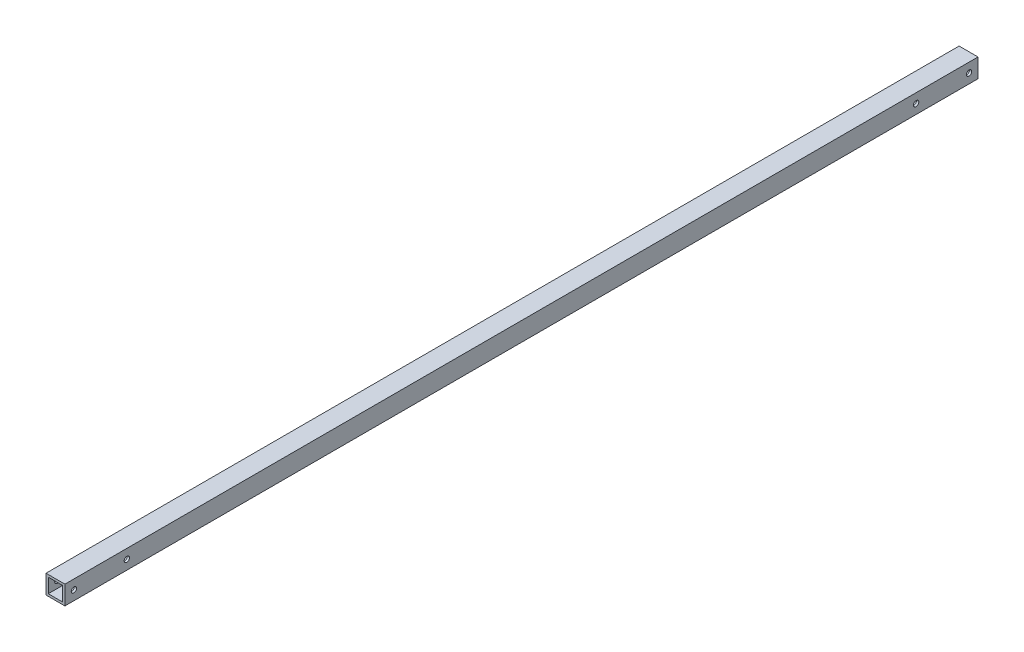
ISO-10303-21;
HEADER;
FILE_DESCRIPTION(('STEP AP214'),'2;1');
FILE_NAME('part.step','',(''),(''),'','','');
FILE_SCHEMA(('AUTOMOTIVE_DESIGN { 1 0 10303 214 1 1 1 1 }'));
ENDSEC;
DATA;
#1=APPLICATION_CONTEXT('core data for automotive mechanical design processes');
#2=APPLICATION_PROTOCOL_DEFINITION('international standard','automotive_design',2000,#1);
#3=PRODUCT_CONTEXT('',#1,'mechanical');
#4=PRODUCT('Part','Part','',(#3));
#5=PRODUCT_RELATED_PRODUCT_CATEGORY('part','',(#4));
#6=PRODUCT_DEFINITION_FORMATION('','',#4);
#7=PRODUCT_DEFINITION_CONTEXT('part definition',#1,'design');
#8=PRODUCT_DEFINITION('design','',#6,#7);
#9=PRODUCT_DEFINITION_SHAPE('','',#8);
#10=(LENGTH_UNIT() NAMED_UNIT(*) SI_UNIT(.MILLI.,.METRE.));
#11=(NAMED_UNIT(*) PLANE_ANGLE_UNIT() SI_UNIT($,.RADIAN.));
#12=(NAMED_UNIT(*) SI_UNIT($,.STERADIAN.) SOLID_ANGLE_UNIT());
#13=UNCERTAINTY_MEASURE_WITH_UNIT(LENGTH_MEASURE(1.E-05),#10,'distance_accuracy_value','');
#14=(GEOMETRIC_REPRESENTATION_CONTEXT(3) GLOBAL_UNCERTAINTY_ASSIGNED_CONTEXT((#13)) GLOBAL_UNIT_ASSIGNED_CONTEXT((#10,
#11,#12)) REPRESENTATION_CONTEXT('',''));
#15=CARTESIAN_POINT('',(0.,0.,0.));
#16=DIRECTION('',(0.,0.,1.));
#17=DIRECTION('',(1.,0.,0.));
#18=AXIS2_PLACEMENT_3D('',#15,#16,#17);
#19=CARTESIAN_POINT('',(0.,-25.,1207.3));
#20=DIRECTION('',(0.,0.,1.));
#21=DIRECTION('',(1.,0.,0.));
#22=AXIS2_PLACEMENT_3D('',#19,#20,#21);
#23=PLANE('',#22);
#24=DIRECTION('',(0.,-1.,0.));
#25=VECTOR('',#24,1.);
#26=CARTESIAN_POINT('',(0.,0.,1207.3));
#27=LINE('',#26,#25);
#28=CARTESIAN_POINT('',(0.,0.,1207.3));
#29=VERTEX_POINT('',#28);
#30=CARTESIAN_POINT('',(0.,-25.,1207.3));
#31=VERTEX_POINT('',#30);
#32=EDGE_CURVE('E140',#29,#31,#27,.T.);
#33=ORIENTED_EDGE('',*,*,#32,.T.);
#34=DIRECTION('',(1.,0.,0.));
#35=VECTOR('',#34,1.);
#36=CARTESIAN_POINT('',(0.,-25.,1207.3));
#37=LINE('',#36,#35);
#38=CARTESIAN_POINT('',(25.,-25.,1207.3));
#39=VERTEX_POINT('',#38);
#40=EDGE_CURVE('E143',#31,#39,#37,.T.);
#41=ORIENTED_EDGE('',*,*,#40,.T.);
#42=DIRECTION('',(0.,1.,0.));
#43=VECTOR('',#42,1.);
#44=CARTESIAN_POINT('',(25.,0.,1207.3));
#45=LINE('',#44,#43);
#46=CARTESIAN_POINT('',(25.,0.,1207.3));
#47=VERTEX_POINT('',#46);
#48=EDGE_CURVE('E146',#39,#47,#45,.T.);
#49=ORIENTED_EDGE('',*,*,#48,.T.);
#50=DIRECTION('',(-1.,0.,0.));
#51=VECTOR('',#50,1.);
#52=CARTESIAN_POINT('',(0.,0.,1207.3));
#53=LINE('',#52,#51);
#54=EDGE_CURVE('E148',#47,#29,#53,.T.);
#55=ORIENTED_EDGE('',*,*,#54,.T.);
#56=EDGE_LOOP('',(#33,#41,#49,#55));
#57=FACE_BOUND('',#56,.T.);
#58=DIRECTION('',(1.,0.,0.));
#59=VECTOR('',#58,1.);
#60=CARTESIAN_POINT('',(3.,-22.,1207.3));
#61=LINE('',#60,#59);
#62=CARTESIAN_POINT('',(3.,-22.,1207.3));
#63=VERTEX_POINT('',#62);
#64=CARTESIAN_POINT('',(22.,-22.,1207.3));
#65=VERTEX_POINT('',#64);
#66=EDGE_CURVE('E110',#63,#65,#61,.T.);
#67=ORIENTED_EDGE('',*,*,#66,.F.);
#68=DIRECTION('',(0.,-1.,0.));
#69=VECTOR('',#68,1.);
#70=CARTESIAN_POINT('',(3.,-3.,1207.3));
#71=LINE('',#70,#69);
#72=CARTESIAN_POINT('',(3.,-3.,1207.3));
#73=VERTEX_POINT('',#72);
#74=EDGE_CURVE('E102',#73,#63,#71,.T.);
#75=ORIENTED_EDGE('',*,*,#74,.F.);
#76=DIRECTION('',(-1.,0.,0.));
#77=VECTOR('',#76,1.);
#78=CARTESIAN_POINT('',(3.,-3.,1207.3));
#79=LINE('',#78,#77);
#80=CARTESIAN_POINT('',(22.,-3.,1207.3));
#81=VERTEX_POINT('',#80);
#82=EDGE_CURVE('E124',#81,#73,#79,.T.);
#83=ORIENTED_EDGE('',*,*,#82,.F.);
#84=DIRECTION('',(0.,1.,0.));
#85=VECTOR('',#84,1.);
#86=CARTESIAN_POINT('',(22.,-3.,1207.3));
#87=LINE('',#86,#85);
#88=EDGE_CURVE('E122',#65,#81,#87,.T.);
#89=ORIENTED_EDGE('',*,*,#88,.F.);
#90=EDGE_LOOP('',(#67,#75,#83,#89));
#91=FACE_BOUND('',#90,.T.);
#92=ADVANCED_FACE('F35',(#57,#91),#23,.T.);
#93=CARTESIAN_POINT('',(0.,-25.,0.));
#94=DIRECTION('',(0.,0.,1.));
#95=DIRECTION('',(1.,0.,0.));
#96=AXIS2_PLACEMENT_3D('',#93,#94,#95);
#97=PLANE('',#96);
#98=DIRECTION('',(0.,-1.,0.));
#99=VECTOR('',#98,1.);
#100=CARTESIAN_POINT('',(0.,0.,0.));
#101=LINE('',#100,#99);
#102=CARTESIAN_POINT('',(0.,0.,0.));
#103=VERTEX_POINT('',#102);
#104=CARTESIAN_POINT('',(0.,-25.,0.));
#105=VERTEX_POINT('',#104);
#106=EDGE_CURVE('E118',#103,#105,#101,.T.);
#107=ORIENTED_EDGE('',*,*,#106,.F.);
#108=DIRECTION('',(-1.,0.,0.));
#109=VECTOR('',#108,1.);
#110=CARTESIAN_POINT('',(0.,0.,0.));
#111=LINE('',#110,#109);
#112=CARTESIAN_POINT('',(25.,0.,0.));
#113=VERTEX_POINT('',#112);
#114=EDGE_CURVE('E144',#113,#103,#111,.T.);
#115=ORIENTED_EDGE('',*,*,#114,.F.);
#116=DIRECTION('',(0.,1.,0.));
#117=VECTOR('',#116,1.);
#118=CARTESIAN_POINT('',(25.,0.,0.));
#119=LINE('',#118,#117);
#120=CARTESIAN_POINT('',(25.,-25.,0.));
#121=VERTEX_POINT('',#120);
#122=EDGE_CURVE('E155',#121,#113,#119,.T.);
#123=ORIENTED_EDGE('',*,*,#122,.F.);
#124=DIRECTION('',(1.,0.,0.));
#125=VECTOR('',#124,1.);
#126=CARTESIAN_POINT('',(0.,-25.,0.));
#127=LINE('',#126,#125);
#128=EDGE_CURVE('E153',#105,#121,#127,.T.);
#129=ORIENTED_EDGE('',*,*,#128,.F.);
#130=EDGE_LOOP('',(#107,#115,#123,#129));
#131=FACE_BOUND('',#130,.T.);
#132=DIRECTION('',(0.,-1.,0.));
#133=VECTOR('',#132,1.);
#134=CARTESIAN_POINT('',(3.,-3.,0.));
#135=LINE('',#134,#133);
#136=CARTESIAN_POINT('',(3.,-3.,0.));
#137=VERTEX_POINT('',#136);
#138=CARTESIAN_POINT('',(3.,-22.,0.));
#139=VERTEX_POINT('',#138);
#140=EDGE_CURVE('E60',#137,#139,#135,.T.);
#141=ORIENTED_EDGE('',*,*,#140,.T.);
#142=DIRECTION('',(1.,0.,0.));
#143=VECTOR('',#142,1.);
#144=CARTESIAN_POINT('',(3.,-22.,0.));
#145=LINE('',#144,#143);
#146=CARTESIAN_POINT('',(22.,-22.,0.));
#147=VERTEX_POINT('',#146);
#148=EDGE_CURVE('E117',#139,#147,#145,.T.);
#149=ORIENTED_EDGE('',*,*,#148,.T.);
#150=DIRECTION('',(0.,1.,0.));
#151=VECTOR('',#150,1.);
#152=CARTESIAN_POINT('',(22.,-3.,0.));
#153=LINE('',#152,#151);
#154=CARTESIAN_POINT('',(22.,-3.,0.));
#155=VERTEX_POINT('',#154);
#156=EDGE_CURVE('E132',#147,#155,#153,.T.);
#157=ORIENTED_EDGE('',*,*,#156,.T.);
#158=DIRECTION('',(-1.,0.,0.));
#159=VECTOR('',#158,1.);
#160=CARTESIAN_POINT('',(3.,-3.,0.));
#161=LINE('',#160,#159);
#162=EDGE_CURVE('E111',#155,#137,#161,.T.);
#163=ORIENTED_EDGE('',*,*,#162,.T.);
#164=EDGE_LOOP('',(#141,#149,#157,#163));
#165=FACE_BOUND('',#164,.T.);
#166=ADVANCED_FACE('F202',(#131,#165),#97,.F.);
#167=CARTESIAN_POINT('',(0.,0.,1207.3));
#168=DIRECTION('',(1.,0.,0.));
#169=DIRECTION('',(0.,1.,0.));
#170=AXIS2_PLACEMENT_3D('',#167,#168,#169);
#171=PLANE('',#170);
#172=CARTESIAN_POINT('',(0.,-12.5,1195.44));
#173=DIRECTION('',(-1.,0.,0.));
#174=DIRECTION('',(0.,0.,1.));
#175=AXIS2_PLACEMENT_3D('',#172,#173,#174);
#176=CIRCLE('',#175,3.5);
#177=CARTESIAN_POINT('',(0.,-12.5,1198.94));
#178=VERTEX_POINT('',#177);
#179=EDGE_CURVE('E275',#178,#178,#176,.T.);
#180=ORIENTED_EDGE('',*,*,#179,.F.);
#181=EDGE_LOOP('',(#180));
#182=FACE_BOUND('',#181,.T.);
#183=CARTESIAN_POINT('',(0.,-12.5,1125.44));
#184=DIRECTION('',(-1.,0.,0.));
#185=DIRECTION('',(0.,0.,1.));
#186=AXIS2_PLACEMENT_3D('',#183,#184,#185);
#187=CIRCLE('',#186,3.5);
#188=CARTESIAN_POINT('',(0.,-12.5,1128.94));
#189=VERTEX_POINT('',#188);
#190=EDGE_CURVE('E261',#189,#189,#187,.T.);
#191=ORIENTED_EDGE('',*,*,#190,.F.);
#192=EDGE_LOOP('',(#191));
#193=FACE_BOUND('',#192,.T.);
#194=CARTESIAN_POINT('',(0.,-12.5,11.8));
#195=DIRECTION('',(-1.,0.,0.));
#196=DIRECTION('',(0.,0.,1.));
#197=AXIS2_PLACEMENT_3D('',#194,#195,#196);
#198=CIRCLE('',#197,3.5);
#199=CARTESIAN_POINT('',(0.,-12.5,15.3));
#200=VERTEX_POINT('',#199);
#201=EDGE_CURVE('E258',#200,#200,#198,.T.);
#202=ORIENTED_EDGE('',*,*,#201,.F.);
#203=EDGE_LOOP('',(#202));
#204=FACE_BOUND('',#203,.T.);
#205=CARTESIAN_POINT('',(0.,-12.5,81.8));
#206=DIRECTION('',(-1.,0.,0.));
#207=DIRECTION('',(0.,0.,1.));
#208=AXIS2_PLACEMENT_3D('',#205,#206,#207);
#209=CIRCLE('',#208,3.5);
#210=CARTESIAN_POINT('',(0.,-12.5,85.3));
#211=VERTEX_POINT('',#210);
#212=EDGE_CURVE('E167',#211,#211,#209,.T.);
#213=ORIENTED_EDGE('',*,*,#212,.F.);
#214=EDGE_LOOP('',(#213));
#215=FACE_BOUND('',#214,.T.);
#216=ORIENTED_EDGE('',*,*,#106,.T.);
#217=DIRECTION('',(0.,0.,-1.));
#218=VECTOR('',#217,1.);
#219=CARTESIAN_POINT('',(0.,-25.,1207.3));
#220=LINE('',#219,#218);
#221=EDGE_CURVE('E11',#31,#105,#220,.T.);
#222=ORIENTED_EDGE('',*,*,#221,.F.);
#223=ORIENTED_EDGE('',*,*,#32,.F.);
#224=DIRECTION('',(0.,0.,-1.));
#225=VECTOR('',#224,1.);
#226=CARTESIAN_POINT('',(0.,0.,1207.3));
#227=LINE('',#226,#225);
#228=EDGE_CURVE('E150',#29,#103,#227,.T.);
#229=ORIENTED_EDGE('',*,*,#228,.T.);
#230=EDGE_LOOP('',(#216,#222,#223,#229));
#231=FACE_BOUND('',#230,.T.);
#232=ADVANCED_FACE('F37',(#182,#193,#204,#215,#231),#171,.F.);
#233=CARTESIAN_POINT('',(0.,-25.,1207.3));
#234=DIRECTION('',(0.,1.,0.));
#235=DIRECTION('',(0.,0.,1.));
#236=AXIS2_PLACEMENT_3D('',#233,#234,#235);
#237=PLANE('',#236);
#238=ORIENTED_EDGE('',*,*,#128,.T.);
#239=DIRECTION('',(0.,0.,-1.));
#240=VECTOR('',#239,1.);
#241=CARTESIAN_POINT('',(25.,-25.,1207.3));
#242=LINE('',#241,#240);
#243=EDGE_CURVE('E44',#39,#121,#242,.T.);
#244=ORIENTED_EDGE('',*,*,#243,.F.);
#245=ORIENTED_EDGE('',*,*,#40,.F.);
#246=ORIENTED_EDGE('',*,*,#221,.T.);
#247=EDGE_LOOP('',(#238,#244,#245,#246));
#248=FACE_BOUND('',#247,.T.);
#249=ADVANCED_FACE('F218',(#248),#237,.F.);
#250=CARTESIAN_POINT('',(25.,0.,1207.3));
#251=DIRECTION('',(-1.,0.,0.));
#252=DIRECTION('',(0.,-1.,0.));
#253=AXIS2_PLACEMENT_3D('',#250,#251,#252);
#254=PLANE('',#253);
#255=CARTESIAN_POINT('',(25.,-12.5,1125.44));
#256=DIRECTION('',(-1.,0.,0.));
#257=DIRECTION('',(0.,-1.,0.));
#258=AXIS2_PLACEMENT_3D('',#255,#256,#257);
#259=CIRCLE('',#258,3.49999999999999);
#260=CARTESIAN_POINT('',(25.,-16.,1125.44));
#261=VERTEX_POINT('',#260);
#262=EDGE_CURVE('E281',#261,#261,#259,.T.);
#263=ORIENTED_EDGE('',*,*,#262,.T.);
#264=EDGE_LOOP('',(#263));
#265=FACE_BOUND('',#264,.T.);
#266=CARTESIAN_POINT('',(25.,-12.5,1195.44));
#267=DIRECTION('',(-1.,0.,0.));
#268=DIRECTION('',(0.,-1.,0.));
#269=AXIS2_PLACEMENT_3D('',#266,#267,#268);
#270=CIRCLE('',#269,3.49999999999999);
#271=CARTESIAN_POINT('',(25.,-16.,1195.44));
#272=VERTEX_POINT('',#271);
#273=EDGE_CURVE('E271',#272,#272,#270,.T.);
#274=ORIENTED_EDGE('',*,*,#273,.T.);
#275=EDGE_LOOP('',(#274));
#276=FACE_BOUND('',#275,.T.);
#277=CARTESIAN_POINT('',(25.,-12.5,11.8));
#278=DIRECTION('',(-1.,0.,0.));
#279=DIRECTION('',(0.,-1.,0.));
#280=AXIS2_PLACEMENT_3D('',#277,#278,#279);
#281=CIRCLE('',#280,3.49999999999999);
#282=CARTESIAN_POINT('',(25.,-16.,11.8));
#283=VERTEX_POINT('',#282);
#284=EDGE_CURVE('E173',#283,#283,#281,.T.);
#285=ORIENTED_EDGE('',*,*,#284,.T.);
#286=EDGE_LOOP('',(#285));
#287=FACE_BOUND('',#286,.T.);
#288=CARTESIAN_POINT('',(25.,-12.5,81.8));
#289=DIRECTION('',(-1.,0.,0.));
#290=DIRECTION('',(0.,-1.,0.));
#291=AXIS2_PLACEMENT_3D('',#288,#289,#290);
#292=CIRCLE('',#291,3.49999999999999);
#293=CARTESIAN_POINT('',(25.,-16.,81.8));
#294=VERTEX_POINT('',#293);
#295=EDGE_CURVE('E130',#294,#294,#292,.T.);
#296=ORIENTED_EDGE('',*,*,#295,.T.);
#297=EDGE_LOOP('',(#296));
#298=FACE_BOUND('',#297,.T.);
#299=ORIENTED_EDGE('',*,*,#122,.T.);
#300=DIRECTION('',(0.,0.,-1.));
#301=VECTOR('',#300,1.);
#302=CARTESIAN_POINT('',(25.,0.,1207.3));
#303=LINE('',#302,#301);
#304=EDGE_CURVE('E160',#47,#113,#303,.T.);
#305=ORIENTED_EDGE('',*,*,#304,.F.);
#306=ORIENTED_EDGE('',*,*,#48,.F.);
#307=ORIENTED_EDGE('',*,*,#243,.T.);
#308=EDGE_LOOP('',(#299,#305,#306,#307));
#309=FACE_BOUND('',#308,.T.);
#310=ADVANCED_FACE('F184',(#265,#276,#287,#298,#309),#254,.F.);
#311=CARTESIAN_POINT('',(0.,0.,1207.3));
#312=DIRECTION('',(0.,-1.,0.));
#313=DIRECTION('',(0.,0.,-1.));
#314=AXIS2_PLACEMENT_3D('',#311,#312,#313);
#315=PLANE('',#314);
#316=ORIENTED_EDGE('',*,*,#114,.T.);
#317=ORIENTED_EDGE('',*,*,#228,.F.);
#318=ORIENTED_EDGE('',*,*,#54,.F.);
#319=ORIENTED_EDGE('',*,*,#304,.T.);
#320=EDGE_LOOP('',(#316,#317,#318,#319));
#321=FACE_BOUND('',#320,.T.);
#322=ADVANCED_FACE('F213',(#321),#315,.F.);
#323=CARTESIAN_POINT('',(3.,-3.,1207.3));
#324=DIRECTION('',(1.,0.,0.));
#325=DIRECTION('',(0.,1.,0.));
#326=AXIS2_PLACEMENT_3D('',#323,#324,#325);
#327=PLANE('',#326);
#328=CARTESIAN_POINT('',(3.,-12.5,1195.44));
#329=DIRECTION('',(1.,0.,0.));
#330=DIRECTION('',(0.,1.,0.));
#331=AXIS2_PLACEMENT_3D('',#328,#329,#330);
#332=CIRCLE('',#331,3.49999999999999);
#333=CARTESIAN_POINT('',(3.,-9.00000000000001,1195.44));
#334=VERTEX_POINT('',#333);
#335=EDGE_CURVE('E278',#334,#334,#332,.T.);
#336=ORIENTED_EDGE('',*,*,#335,.F.);
#337=EDGE_LOOP('',(#336));
#338=FACE_BOUND('',#337,.T.);
#339=CARTESIAN_POINT('',(3.,-12.5,1125.44));
#340=DIRECTION('',(1.,0.,0.));
#341=DIRECTION('',(0.,1.,0.));
#342=AXIS2_PLACEMENT_3D('',#339,#340,#341);
#343=CIRCLE('',#342,3.49999999999999);
#344=CARTESIAN_POINT('',(3.,-9.00000000000001,1125.44));
#345=VERTEX_POINT('',#344);
#346=EDGE_CURVE('E266',#345,#345,#343,.T.);
#347=ORIENTED_EDGE('',*,*,#346,.F.);
#348=EDGE_LOOP('',(#347));
#349=FACE_BOUND('',#348,.T.);
#350=CARTESIAN_POINT('',(3.,-12.5,11.8));
#351=DIRECTION('',(1.,0.,0.));
#352=DIRECTION('',(0.,1.,0.));
#353=AXIS2_PLACEMENT_3D('',#350,#351,#352);
#354=CIRCLE('',#353,3.49999999999999);
#355=CARTESIAN_POINT('',(3.,-9.00000000000001,11.8));
#356=VERTEX_POINT('',#355);
#357=EDGE_CURVE('E178',#356,#356,#354,.T.);
#358=ORIENTED_EDGE('',*,*,#357,.F.);
#359=EDGE_LOOP('',(#358));
#360=FACE_BOUND('',#359,.T.);
#361=CARTESIAN_POINT('',(3.,-12.5,81.8));
#362=DIRECTION('',(1.,0.,0.));
#363=DIRECTION('',(0.,1.,0.));
#364=AXIS2_PLACEMENT_3D('',#361,#362,#363);
#365=CIRCLE('',#364,3.49999999999999);
#366=CARTESIAN_POINT('',(3.,-9.00000000000001,81.8));
#367=VERTEX_POINT('',#366);
#368=EDGE_CURVE('E166',#367,#367,#365,.T.);
#369=ORIENTED_EDGE('',*,*,#368,.F.);
#370=EDGE_LOOP('',(#369));
#371=FACE_BOUND('',#370,.T.);
#372=ORIENTED_EDGE('',*,*,#140,.F.);
#373=DIRECTION('',(0.,0.,-1.));
#374=VECTOR('',#373,1.);
#375=CARTESIAN_POINT('',(3.,-3.,1207.3));
#376=LINE('',#375,#374);
#377=EDGE_CURVE('E106',#73,#137,#376,.T.);
#378=ORIENTED_EDGE('',*,*,#377,.F.);
#379=ORIENTED_EDGE('',*,*,#74,.T.);
#380=DIRECTION('',(0.,0.,-1.));
#381=VECTOR('',#380,1.);
#382=CARTESIAN_POINT('',(3.,-22.,1207.3));
#383=LINE('',#382,#381);
#384=EDGE_CURVE('E105',#63,#139,#383,.T.);
#385=ORIENTED_EDGE('',*,*,#384,.T.);
#386=EDGE_LOOP('',(#372,#378,#379,#385));
#387=FACE_BOUND('',#386,.T.);
#388=ADVANCED_FACE('F104',(#338,#349,#360,#371,#387),#327,.T.);
#389=CARTESIAN_POINT('',(3.,-22.,1207.3));
#390=DIRECTION('',(0.,1.,0.));
#391=DIRECTION('',(0.,0.,1.));
#392=AXIS2_PLACEMENT_3D('',#389,#390,#391);
#393=PLANE('',#392);
#394=ORIENTED_EDGE('',*,*,#148,.F.);
#395=ORIENTED_EDGE('',*,*,#384,.F.);
#396=ORIENTED_EDGE('',*,*,#66,.T.);
#397=DIRECTION('',(0.,0.,-1.));
#398=VECTOR('',#397,1.);
#399=CARTESIAN_POINT('',(22.,-22.,1207.3));
#400=LINE('',#399,#398);
#401=EDGE_CURVE('E119',#65,#147,#400,.T.);
#402=ORIENTED_EDGE('',*,*,#401,.T.);
#403=EDGE_LOOP('',(#394,#395,#396,#402));
#404=FACE_BOUND('',#403,.T.);
#405=ADVANCED_FACE('F114',(#404),#393,.T.);
#406=CARTESIAN_POINT('',(22.,-3.,1207.3));
#407=DIRECTION('',(-1.,0.,0.));
#408=DIRECTION('',(0.,-1.,0.));
#409=AXIS2_PLACEMENT_3D('',#406,#407,#408);
#410=PLANE('',#409);
#411=CARTESIAN_POINT('',(22.,-12.5,1125.44));
#412=DIRECTION('',(-1.,0.,0.));
#413=DIRECTION('',(0.,-1.,0.));
#414=AXIS2_PLACEMENT_3D('',#411,#412,#413);
#415=CIRCLE('',#414,3.49999999999999);
#416=CARTESIAN_POINT('',(22.,-16.,1125.44));
#417=VERTEX_POINT('',#416);
#418=EDGE_CURVE('E249',#417,#417,#415,.T.);
#419=ORIENTED_EDGE('',*,*,#418,.F.);
#420=EDGE_LOOP('',(#419));
#421=FACE_BOUND('',#420,.T.);
#422=CARTESIAN_POINT('',(22.,-12.5,1195.44));
#423=DIRECTION('',(-1.,0.,0.));
#424=DIRECTION('',(0.,-1.,0.));
#425=AXIS2_PLACEMENT_3D('',#422,#423,#424);
#426=CIRCLE('',#425,3.49999999999999);
#427=CARTESIAN_POINT('',(22.,-16.,1195.44));
#428=VERTEX_POINT('',#427);
#429=EDGE_CURVE('E253',#428,#428,#426,.T.);
#430=ORIENTED_EDGE('',*,*,#429,.F.);
#431=EDGE_LOOP('',(#430));
#432=FACE_BOUND('',#431,.T.);
#433=CARTESIAN_POINT('',(22.,-12.5,11.8));
#434=DIRECTION('',(-1.,0.,0.));
#435=DIRECTION('',(0.,-1.,0.));
#436=AXIS2_PLACEMENT_3D('',#433,#434,#435);
#437=CIRCLE('',#436,3.49999999999999);
#438=CARTESIAN_POINT('',(22.,-16.,11.8));
#439=VERTEX_POINT('',#438);
#440=EDGE_CURVE('E39',#439,#439,#437,.T.);
#441=ORIENTED_EDGE('',*,*,#440,.F.);
#442=EDGE_LOOP('',(#441));
#443=FACE_BOUND('',#442,.T.);
#444=CARTESIAN_POINT('',(22.,-12.5,81.8));
#445=DIRECTION('',(-1.,0.,0.));
#446=DIRECTION('',(0.,-1.,0.));
#447=AXIS2_PLACEMENT_3D('',#444,#445,#446);
#448=CIRCLE('',#447,3.49999999999999);
#449=CARTESIAN_POINT('',(22.,-16.,81.8));
#450=VERTEX_POINT('',#449);
#451=EDGE_CURVE('E164',#450,#450,#448,.T.);
#452=ORIENTED_EDGE('',*,*,#451,.F.);
#453=EDGE_LOOP('',(#452));
#454=FACE_BOUND('',#453,.T.);
#455=ORIENTED_EDGE('',*,*,#156,.F.);
#456=ORIENTED_EDGE('',*,*,#401,.F.);
#457=ORIENTED_EDGE('',*,*,#88,.T.);
#458=DIRECTION('',(0.,0.,-1.));
#459=VECTOR('',#458,1.);
#460=CARTESIAN_POINT('',(22.,-3.,1207.3));
#461=LINE('',#460,#459);
#462=EDGE_CURVE('E52',#81,#155,#461,.T.);
#463=ORIENTED_EDGE('',*,*,#462,.T.);
#464=EDGE_LOOP('',(#455,#456,#457,#463));
#465=FACE_BOUND('',#464,.T.);
#466=ADVANCED_FACE('F198',(#421,#432,#443,#454,#465),#410,.T.);
#467=CARTESIAN_POINT('',(3.,-3.,1207.3));
#468=DIRECTION('',(0.,-1.,0.));
#469=DIRECTION('',(0.,0.,-1.));
#470=AXIS2_PLACEMENT_3D('',#467,#468,#469);
#471=PLANE('',#470);
#472=ORIENTED_EDGE('',*,*,#162,.F.);
#473=ORIENTED_EDGE('',*,*,#462,.F.);
#474=ORIENTED_EDGE('',*,*,#82,.T.);
#475=ORIENTED_EDGE('',*,*,#377,.T.);
#476=EDGE_LOOP('',(#472,#473,#474,#475));
#477=FACE_BOUND('',#476,.T.);
#478=ADVANCED_FACE('F190',(#477),#471,.T.);
#479=CARTESIAN_POINT('',(0.,-12.5,81.8));
#480=DIRECTION('',(-1.,0.,0.));
#481=DIRECTION('',(0.,0.,1.));
#482=AXIS2_PLACEMENT_3D('',#479,#480,#481);
#483=CYLINDRICAL_SURFACE('',#482,3.49999999999999);
#484=ORIENTED_EDGE('',*,*,#451,.T.);
#485=EDGE_LOOP('',(#484));
#486=FACE_BOUND('',#485,.T.);
#487=ORIENTED_EDGE('',*,*,#295,.F.);
#488=EDGE_LOOP('',(#487));
#489=FACE_BOUND('',#488,.T.);
#490=ADVANCED_FACE('F187',(#486,#489),#483,.F.);
#491=ORIENTED_EDGE('',*,*,#368,.T.);
#492=EDGE_LOOP('',(#491));
#493=FACE_BOUND('',#492,.T.);
#494=ORIENTED_EDGE('',*,*,#212,.T.);
#495=EDGE_LOOP('',(#494));
#496=FACE_BOUND('',#495,.T.);
#497=ADVANCED_FACE('F189',(#493,#496),#483,.F.);
#498=CARTESIAN_POINT('',(0.,-12.5,11.8));
#499=DIRECTION('',(-1.,0.,0.));
#500=DIRECTION('',(0.,0.,1.));
#501=AXIS2_PLACEMENT_3D('',#498,#499,#500);
#502=CYLINDRICAL_SURFACE('',#501,3.49999999999999);
#503=ORIENTED_EDGE('',*,*,#440,.T.);
#504=EDGE_LOOP('',(#503));
#505=FACE_BOUND('',#504,.T.);
#506=ORIENTED_EDGE('',*,*,#284,.F.);
#507=EDGE_LOOP('',(#506));
#508=FACE_BOUND('',#507,.T.);
#509=ADVANCED_FACE('F196',(#505,#508),#502,.F.);
#510=ORIENTED_EDGE('',*,*,#357,.T.);
#511=EDGE_LOOP('',(#510));
#512=FACE_BOUND('',#511,.T.);
#513=ORIENTED_EDGE('',*,*,#201,.T.);
#514=EDGE_LOOP('',(#513));
#515=FACE_BOUND('',#514,.T.);
#516=ADVANCED_FACE('F297',(#512,#515),#502,.F.);
#517=CARTESIAN_POINT('',(0.,-12.5,1125.44));
#518=DIRECTION('',(-1.,0.,0.));
#519=DIRECTION('',(0.,0.,1.));
#520=AXIS2_PLACEMENT_3D('',#517,#518,#519);
#521=CYLINDRICAL_SURFACE('',#520,3.49999999999999);
#522=ORIENTED_EDGE('',*,*,#346,.T.);
#523=EDGE_LOOP('',(#522));
#524=FACE_BOUND('',#523,.T.);
#525=ORIENTED_EDGE('',*,*,#190,.T.);
#526=EDGE_LOOP('',(#525));
#527=FACE_BOUND('',#526,.T.);
#528=ADVANCED_FACE('F301',(#524,#527),#521,.F.);
#529=CARTESIAN_POINT('',(0.,-12.5,1195.44));
#530=DIRECTION('',(-1.,0.,0.));
#531=DIRECTION('',(0.,0.,1.));
#532=AXIS2_PLACEMENT_3D('',#529,#530,#531);
#533=CYLINDRICAL_SURFACE('',#532,3.49999999999999);
#534=ORIENTED_EDGE('',*,*,#429,.T.);
#535=EDGE_LOOP('',(#534));
#536=FACE_BOUND('',#535,.T.);
#537=ORIENTED_EDGE('',*,*,#273,.F.);
#538=EDGE_LOOP('',(#537));
#539=FACE_BOUND('',#538,.T.);
#540=ADVANCED_FACE('F306',(#536,#539),#533,.F.);
#541=CARTESIAN_POINT('',(0.,-12.5,1195.44));
#542=DIRECTION('',(-1.,0.,0.));
#543=DIRECTION('',(0.,0.,1.));
#544=AXIS2_PLACEMENT_3D('',#541,#542,#543);
#545=CYLINDRICAL_SURFACE('',#544,3.49999999999999);
#546=ORIENTED_EDGE('',*,*,#335,.T.);
#547=EDGE_LOOP('',(#546));
#548=FACE_BOUND('',#547,.T.);
#549=ORIENTED_EDGE('',*,*,#179,.T.);
#550=EDGE_LOOP('',(#549));
#551=FACE_BOUND('',#550,.T.);
#552=ADVANCED_FACE('F288',(#548,#551),#545,.F.);
#553=CARTESIAN_POINT('',(0.,-12.5,1125.44));
#554=DIRECTION('',(-1.,0.,0.));
#555=DIRECTION('',(0.,0.,1.));
#556=AXIS2_PLACEMENT_3D('',#553,#554,#555);
#557=CYLINDRICAL_SURFACE('',#556,3.49999999999999);
#558=ORIENTED_EDGE('',*,*,#418,.T.);
#559=EDGE_LOOP('',(#558));
#560=FACE_BOUND('',#559,.T.);
#561=ORIENTED_EDGE('',*,*,#262,.F.);
#562=EDGE_LOOP('',(#561));
#563=FACE_BOUND('',#562,.T.);
#564=ADVANCED_FACE('F285',(#560,#563),#557,.F.);
#565=CLOSED_SHELL('',(#92,#166,#232,#249,#310,#322,#388,#405,#466,#478,#490,#497,#509,#516,#528,
#540,#552,#564));
#566=MANIFOLD_SOLID_BREP('B2',#565);
#567=ADVANCED_BREP_SHAPE_REPRESENTATION('',(#18,#566),#14);
#568=SHAPE_DEFINITION_REPRESENTATION(#9,#567);
ENDSEC;
END-ISO-10303-21;
